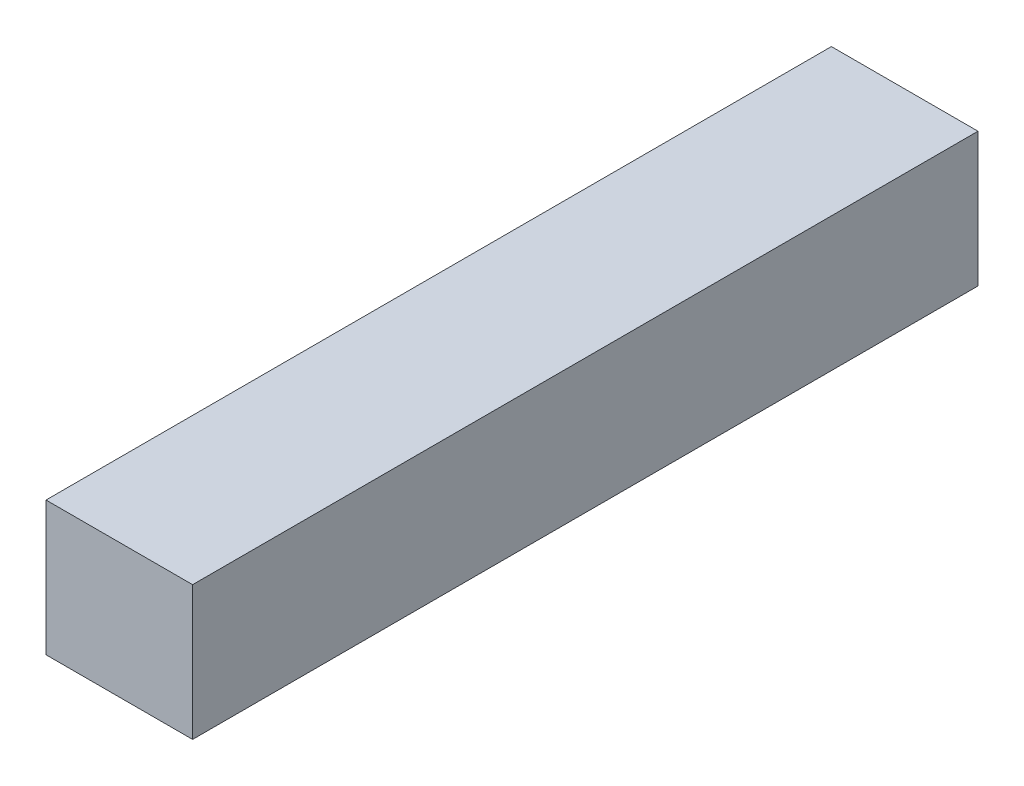
ISO-10303-21;
HEADER;
FILE_DESCRIPTION(('STEP AP214'),'2;1');
FILE_NAME('part.step','',(''),(''),'','','');
FILE_SCHEMA(('AUTOMOTIVE_DESIGN { 1 0 10303 214 1 1 1 1 }'));
ENDSEC;
DATA;
#1=APPLICATION_CONTEXT('core data for automotive mechanical design processes');
#2=APPLICATION_PROTOCOL_DEFINITION('international standard','automotive_design',2000,#1);
#3=PRODUCT_CONTEXT('',#1,'mechanical');
#4=PRODUCT('Part','Part','',(#3));
#5=PRODUCT_RELATED_PRODUCT_CATEGORY('part','',(#4));
#6=PRODUCT_DEFINITION_FORMATION('','',#4);
#7=PRODUCT_DEFINITION_CONTEXT('part definition',#1,'design');
#8=PRODUCT_DEFINITION('design','',#6,#7);
#9=PRODUCT_DEFINITION_SHAPE('','',#8);
#10=(LENGTH_UNIT() NAMED_UNIT(*) SI_UNIT(.MILLI.,.METRE.));
#11=(NAMED_UNIT(*) PLANE_ANGLE_UNIT() SI_UNIT($,.RADIAN.));
#12=(NAMED_UNIT(*) SI_UNIT($,.STERADIAN.) SOLID_ANGLE_UNIT());
#13=UNCERTAINTY_MEASURE_WITH_UNIT(LENGTH_MEASURE(1.E-05),#10,'distance_accuracy_value','');
#14=(GEOMETRIC_REPRESENTATION_CONTEXT(3) GLOBAL_UNCERTAINTY_ASSIGNED_CONTEXT((#13)) GLOBAL_UNIT_ASSIGNED_CONTEXT((#10,
#11,#12)) REPRESENTATION_CONTEXT('',''));
#15=CARTESIAN_POINT('',(0.,0.,0.));
#16=DIRECTION('',(0.,0.,1.));
#17=DIRECTION('',(1.,0.,0.));
#18=AXIS2_PLACEMENT_3D('',#15,#16,#17);
#19=CARTESIAN_POINT('',(0.,12.8,75.));
#20=DIRECTION('',(1.,0.,0.));
#21=DIRECTION('',(0.,1.,0.));
#22=AXIS2_PLACEMENT_3D('',#19,#20,#21);
#23=PLANE('',#22);
#24=DIRECTION('',(0.,-1.,0.));
#25=VECTOR('',#24,1.);
#26=CARTESIAN_POINT('',(0.,12.8,0.));
#27=LINE('',#26,#25);
#28=CARTESIAN_POINT('',(0.,12.8,0.));
#29=VERTEX_POINT('',#28);
#30=CARTESIAN_POINT('',(0.,0.,0.));
#31=VERTEX_POINT('',#30);
#32=EDGE_CURVE('E113',#29,#31,#27,.T.);
#33=ORIENTED_EDGE('',*,*,#32,.T.);
#34=DIRECTION('',(0.,0.,-1.));
#35=VECTOR('',#34,1.);
#36=CARTESIAN_POINT('',(0.,0.,75.));
#37=LINE('',#36,#35);
#38=CARTESIAN_POINT('',(0.,0.,75.));
#39=VERTEX_POINT('',#38);
#40=EDGE_CURVE('E11',#39,#31,#37,.T.);
#41=ORIENTED_EDGE('',*,*,#40,.F.);
#42=DIRECTION('',(0.,-1.,0.));
#43=VECTOR('',#42,1.);
#44=CARTESIAN_POINT('',(0.,12.8,75.));
#45=LINE('',#44,#43);
#46=CARTESIAN_POINT('',(0.,12.8,75.));
#47=VERTEX_POINT('',#46);
#48=EDGE_CURVE('E97',#47,#39,#45,.T.);
#49=ORIENTED_EDGE('',*,*,#48,.F.);
#50=DIRECTION('',(0.,0.,-1.));
#51=VECTOR('',#50,1.);
#52=CARTESIAN_POINT('',(0.,12.8,75.));
#53=LINE('',#52,#51);
#54=EDGE_CURVE('E109',#47,#29,#53,.T.);
#55=ORIENTED_EDGE('',*,*,#54,.T.);
#56=EDGE_LOOP('',(#33,#41,#49,#55));
#57=FACE_BOUND('',#56,.T.);
#58=ADVANCED_FACE('F45',(#57),#23,.F.);
#59=CARTESIAN_POINT('',(0.,0.,75.));
#60=DIRECTION('',(0.,1.,0.));
#61=DIRECTION('',(0.,0.,1.));
#62=AXIS2_PLACEMENT_3D('',#59,#60,#61);
#63=PLANE('',#62);
#64=DIRECTION('',(1.,0.,0.));
#65=VECTOR('',#64,1.);
#66=CARTESIAN_POINT('',(0.,0.,0.));
#67=LINE('',#66,#65);
#68=CARTESIAN_POINT('',(14.,0.,0.));
#69=VERTEX_POINT('',#68);
#70=EDGE_CURVE('E102',#31,#69,#67,.T.);
#71=ORIENTED_EDGE('',*,*,#70,.T.);
#72=DIRECTION('',(0.,0.,-1.));
#73=VECTOR('',#72,1.);
#74=CARTESIAN_POINT('',(14.,0.,75.));
#75=LINE('',#74,#73);
#76=CARTESIAN_POINT('',(14.,0.,75.));
#77=VERTEX_POINT('',#76);
#78=EDGE_CURVE('E54',#77,#69,#75,.T.);
#79=ORIENTED_EDGE('',*,*,#78,.F.);
#80=DIRECTION('',(1.,0.,0.));
#81=VECTOR('',#80,1.);
#82=CARTESIAN_POINT('',(0.,0.,75.));
#83=LINE('',#82,#81);
#84=EDGE_CURVE('E92',#39,#77,#83,.T.);
#85=ORIENTED_EDGE('',*,*,#84,.F.);
#86=ORIENTED_EDGE('',*,*,#40,.T.);
#87=EDGE_LOOP('',(#71,#79,#85,#86));
#88=FACE_BOUND('',#87,.T.);
#89=ADVANCED_FACE('F101',(#88),#63,.F.);
#90=CARTESIAN_POINT('',(14.,0.,75.));
#91=DIRECTION('',(-1.,0.,0.));
#92=DIRECTION('',(0.,0.,1.));
#93=AXIS2_PLACEMENT_3D('',#90,#91,#92);
#94=PLANE('',#93);
#95=DIRECTION('',(0.,1.,0.));
#96=VECTOR('',#95,1.);
#97=CARTESIAN_POINT('',(14.,0.,0.));
#98=LINE('',#97,#96);
#99=CARTESIAN_POINT('',(14.,12.8,0.));
#100=VERTEX_POINT('',#99);
#101=EDGE_CURVE('E79',#69,#100,#98,.T.);
#102=ORIENTED_EDGE('',*,*,#101,.T.);
#103=DIRECTION('',(0.,0.,-1.));
#104=VECTOR('',#103,1.);
#105=CARTESIAN_POINT('',(14.,12.8,75.));
#106=LINE('',#105,#104);
#107=CARTESIAN_POINT('',(14.,12.8,75.));
#108=VERTEX_POINT('',#107);
#109=EDGE_CURVE('E104',#108,#100,#106,.T.);
#110=ORIENTED_EDGE('',*,*,#109,.F.);
#111=DIRECTION('',(0.,1.,0.));
#112=VECTOR('',#111,1.);
#113=CARTESIAN_POINT('',(14.,0.,75.));
#114=LINE('',#113,#112);
#115=EDGE_CURVE('E95',#77,#108,#114,.T.);
#116=ORIENTED_EDGE('',*,*,#115,.F.);
#117=ORIENTED_EDGE('',*,*,#78,.T.);
#118=EDGE_LOOP('',(#102,#110,#116,#117));
#119=FACE_BOUND('',#118,.T.);
#120=ADVANCED_FACE('F105',(#119),#94,.F.);
#121=CARTESIAN_POINT('',(14.,12.8,75.));
#122=DIRECTION('',(0.,-1.,0.));
#123=DIRECTION('',(1.,0.,0.));
#124=AXIS2_PLACEMENT_3D('',#121,#122,#123);
#125=PLANE('',#124);
#126=DIRECTION('',(-1.,0.,0.));
#127=VECTOR('',#126,1.);
#128=CARTESIAN_POINT('',(14.,12.8,0.));
#129=LINE('',#128,#127);
#130=EDGE_CURVE('E85',#100,#29,#129,.T.);
#131=ORIENTED_EDGE('',*,*,#130,.T.);
#132=ORIENTED_EDGE('',*,*,#54,.F.);
#133=DIRECTION('',(-1.,0.,0.));
#134=VECTOR('',#133,1.);
#135=CARTESIAN_POINT('',(14.,12.8,75.));
#136=LINE('',#135,#134);
#137=EDGE_CURVE('E62',#108,#47,#136,.T.);
#138=ORIENTED_EDGE('',*,*,#137,.F.);
#139=ORIENTED_EDGE('',*,*,#109,.T.);
#140=EDGE_LOOP('',(#131,#132,#138,#139));
#141=FACE_BOUND('',#140,.T.);
#142=ADVANCED_FACE('F126',(#141),#125,.F.);
#143=CARTESIAN_POINT('',(0.,0.,75.));
#144=DIRECTION('',(0.,0.,1.));
#145=DIRECTION('',(1.,0.,0.));
#146=AXIS2_PLACEMENT_3D('',#143,#144,#145);
#147=PLANE('',#146);
#148=ORIENTED_EDGE('',*,*,#48,.T.);
#149=ORIENTED_EDGE('',*,*,#84,.T.);
#150=ORIENTED_EDGE('',*,*,#115,.T.);
#151=ORIENTED_EDGE('',*,*,#137,.T.);
#152=EDGE_LOOP('',(#148,#149,#150,#151));
#153=FACE_BOUND('',#152,.T.);
#154=ADVANCED_FACE('F93',(#153),#147,.T.);
#155=CARTESIAN_POINT('',(0.,0.,0.));
#156=DIRECTION('',(0.,0.,1.));
#157=DIRECTION('',(1.,0.,0.));
#158=AXIS2_PLACEMENT_3D('',#155,#156,#157);
#159=PLANE('',#158);
#160=ORIENTED_EDGE('',*,*,#32,.F.);
#161=ORIENTED_EDGE('',*,*,#130,.F.);
#162=ORIENTED_EDGE('',*,*,#101,.F.);
#163=ORIENTED_EDGE('',*,*,#70,.F.);
#164=EDGE_LOOP('',(#160,#161,#162,#163));
#165=FACE_BOUND('',#164,.T.);
#166=ADVANCED_FACE('F129',(#165),#159,.F.);
#167=CLOSED_SHELL('',(#58,#89,#120,#142,#154,#166));
#168=MANIFOLD_SOLID_BREP('B2',#167);
#169=ADVANCED_BREP_SHAPE_REPRESENTATION('',(#18,#168),#14);
#170=SHAPE_DEFINITION_REPRESENTATION(#9,#169);
ENDSEC;
END-ISO-10303-21;
